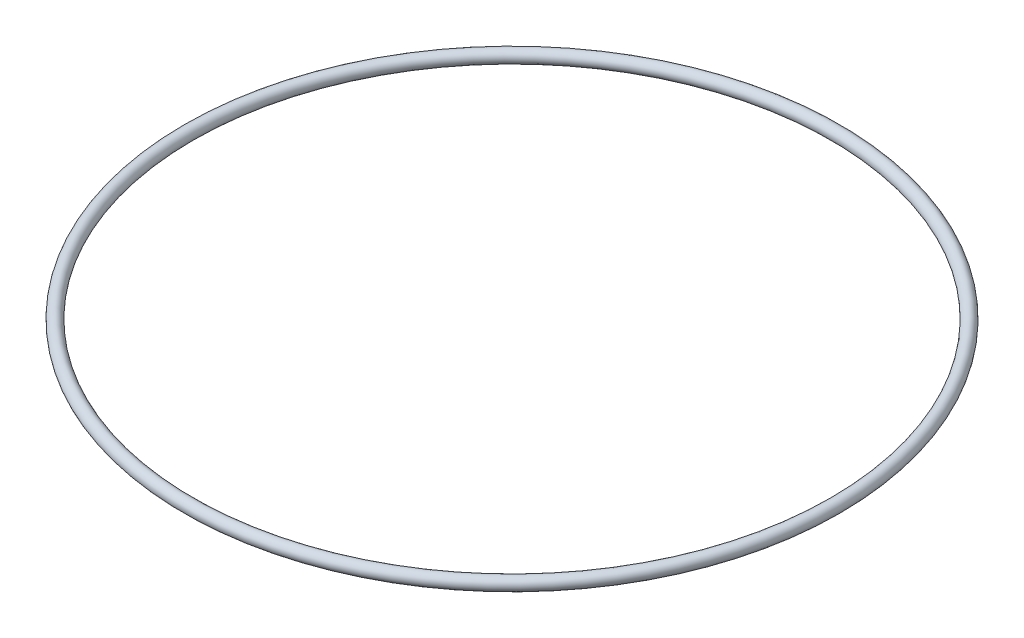
ISO-10303-21;
HEADER;
FILE_DESCRIPTION(('STEP AP214'),'2;1');
FILE_NAME('part.step','',(''),(''),'','','');
FILE_SCHEMA(('AUTOMOTIVE_DESIGN { 1 0 10303 214 1 1 1 1 }'));
ENDSEC;
DATA;
#1=APPLICATION_CONTEXT('core data for automotive mechanical design processes');
#2=APPLICATION_PROTOCOL_DEFINITION('international standard','automotive_design',2000,#1);
#3=PRODUCT_CONTEXT('',#1,'mechanical');
#4=PRODUCT('Part','Part','',(#3));
#5=PRODUCT_RELATED_PRODUCT_CATEGORY('part','',(#4));
#6=PRODUCT_DEFINITION_FORMATION('','',#4);
#7=PRODUCT_DEFINITION_CONTEXT('part definition',#1,'design');
#8=PRODUCT_DEFINITION('design','',#6,#7);
#9=PRODUCT_DEFINITION_SHAPE('','',#8);
#10=(LENGTH_UNIT() NAMED_UNIT(*) SI_UNIT(.MILLI.,.METRE.));
#11=(NAMED_UNIT(*) PLANE_ANGLE_UNIT() SI_UNIT($,.RADIAN.));
#12=(NAMED_UNIT(*) SI_UNIT($,.STERADIAN.) SOLID_ANGLE_UNIT());
#13=UNCERTAINTY_MEASURE_WITH_UNIT(LENGTH_MEASURE(1.E-05),#10,'distance_accuracy_value','');
#14=(GEOMETRIC_REPRESENTATION_CONTEXT(3) GLOBAL_UNCERTAINTY_ASSIGNED_CONTEXT((#13)) GLOBAL_UNIT_ASSIGNED_CONTEXT((#10,
#11,#12)) REPRESENTATION_CONTEXT('',''));
#15=CARTESIAN_POINT('',(0.,0.,0.));
#16=DIRECTION('',(0.,0.,1.));
#17=DIRECTION('',(1.,0.,0.));
#18=AXIS2_PLACEMENT_3D('',#15,#16,#17);
#19=CARTESIAN_POINT('',(0.,0.,0.));
#20=DIRECTION('',(0.,-1.,0.));
#21=DIRECTION('',(1.,0.,0.));
#22=AXIS2_PLACEMENT_3D('',#19,#20,#21);
#23=TOROIDAL_SURFACE('',#22,20.4,0.400000000000001);
#24=CARTESIAN_POINT('',(20.8,0.,0.));
#25=VERTEX_POINT('',#24);
#26=VERTEX_LOOP('',#25);
#27=FACE_BOUND('',#26,.T.);
#28=ADVANCED_FACE('F40',(#27),#23,.T.);
#29=CLOSED_SHELL('',(#28));
#30=MANIFOLD_SOLID_BREP('B2',#29);
#31=ADVANCED_BREP_SHAPE_REPRESENTATION('',(#18,#30),#14);
#32=SHAPE_DEFINITION_REPRESENTATION(#9,#31);
ENDSEC;
END-ISO-10303-21;
